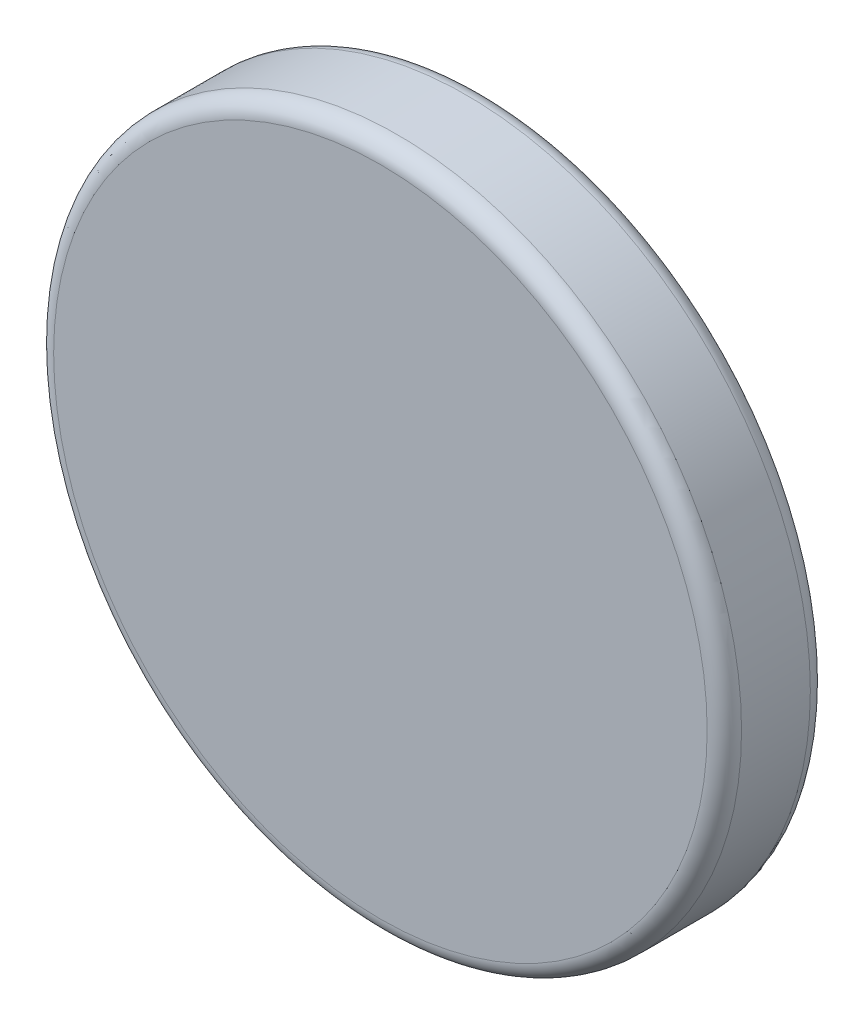
ISO-10303-21;
HEADER;
FILE_DESCRIPTION(('STEP AP214'),'2;1');
FILE_NAME('part.step','',(''),(''),'','','');
FILE_SCHEMA(('AUTOMOTIVE_DESIGN { 1 0 10303 214 1 1 1 1 }'));
ENDSEC;
DATA;
#1=APPLICATION_CONTEXT('core data for automotive mechanical design processes');
#2=APPLICATION_PROTOCOL_DEFINITION('international standard','automotive_design',2000,#1);
#3=PRODUCT_CONTEXT('',#1,'mechanical');
#4=PRODUCT('Part','Part','',(#3));
#5=PRODUCT_RELATED_PRODUCT_CATEGORY('part','',(#4));
#6=PRODUCT_DEFINITION_FORMATION('','',#4);
#7=PRODUCT_DEFINITION_CONTEXT('part definition',#1,'design');
#8=PRODUCT_DEFINITION('design','',#6,#7);
#9=PRODUCT_DEFINITION_SHAPE('','',#8);
#10=(LENGTH_UNIT() NAMED_UNIT(*) SI_UNIT(.MILLI.,.METRE.));
#11=(NAMED_UNIT(*) PLANE_ANGLE_UNIT() SI_UNIT($,.RADIAN.));
#12=(NAMED_UNIT(*) SI_UNIT($,.STERADIAN.) SOLID_ANGLE_UNIT());
#13=UNCERTAINTY_MEASURE_WITH_UNIT(LENGTH_MEASURE(1.E-05),#10,'distance_accuracy_value','');
#14=(GEOMETRIC_REPRESENTATION_CONTEXT(3) GLOBAL_UNCERTAINTY_ASSIGNED_CONTEXT((#13)) GLOBAL_UNIT_ASSIGNED_CONTEXT((#10,
#11,#12)) REPRESENTATION_CONTEXT('',''));
#15=CARTESIAN_POINT('',(0.,0.,0.));
#16=DIRECTION('',(0.,0.,1.));
#17=DIRECTION('',(1.,0.,0.));
#18=AXIS2_PLACEMENT_3D('',#15,#16,#17);
#19=CARTESIAN_POINT('',(-11.7,-6.2,-4.));
#20=DIRECTION('',(0.,0.,1.));
#21=DIRECTION('',(1.,0.,0.));
#22=AXIS2_PLACEMENT_3D('',#19,#20,#21);
#23=PLANE('',#22);
#24=CARTESIAN_POINT('',(-11.7,-6.2,-4.));
#25=DIRECTION('',(0.,0.,1.));
#26=DIRECTION('',(0.,-1.,0.));
#27=AXIS2_PLACEMENT_3D('',#24,#25,#26);
#28=CIRCLE('',#27,8.5);
#29=CARTESIAN_POINT('',(-11.7,-14.7,-4.));
#30=VERTEX_POINT('',#29);
#31=EDGE_CURVE('E106',#30,#30,#28,.T.);
#32=ORIENTED_EDGE('',*,*,#31,.F.);
#33=EDGE_LOOP('',(#32));
#34=FACE_BOUND('',#33,.T.);
#35=ADVANCED_FACE('F15',(#34),#23,.F.);
#36=CARTESIAN_POINT('',(-11.7,-6.2,-3.5));
#37=DIRECTION('',(0.,0.,1.));
#38=DIRECTION('',(1.,0.,0.));
#39=AXIS2_PLACEMENT_3D('',#36,#37,#38);
#40=TOROIDAL_SURFACE('',#39,8.5,0.5);
#41=ORIENTED_EDGE('',*,*,#31,.T.);
#42=EDGE_LOOP('',(#41));
#43=FACE_BOUND('',#42,.T.);
#44=CARTESIAN_POINT('',(-11.7,-6.2,-3.5));
#45=DIRECTION('',(0.,0.,1.));
#46=DIRECTION('',(1.,0.,0.));
#47=AXIS2_PLACEMENT_3D('',#44,#45,#46);
#48=CIRCLE('',#47,9.);
#49=CARTESIAN_POINT('',(-2.7,-6.2,-3.5));
#50=VERTEX_POINT('',#49);
#51=EDGE_CURVE('E19',#50,#50,#48,.F.);
#52=ORIENTED_EDGE('',*,*,#51,.T.);
#53=EDGE_LOOP('',(#52));
#54=FACE_BOUND('',#53,.T.);
#55=ADVANCED_FACE('F93',(#43,#54),#40,.T.);
#56=CARTESIAN_POINT('',(-11.7,-15.2,-3.5));
#57=DIRECTION('',(0.,0.,1.));
#58=DIRECTION('',(1.,0.,0.));
#59=AXIS2_PLACEMENT_3D('',#56,#57,#58);
#60=PLANE('',#59);
#61=ORIENTED_EDGE('',*,*,#51,.F.);
#62=EDGE_LOOP('',(#61));
#63=FACE_BOUND('',#62,.T.);
#64=CARTESIAN_POINT('',(-11.7,-6.2,-3.5));
#65=DIRECTION('',(0.,0.,1.));
#66=DIRECTION('',(0.,-1.,0.));
#67=AXIS2_PLACEMENT_3D('',#64,#65,#66);
#68=CIRCLE('',#67,9.5);
#69=CARTESIAN_POINT('',(-11.7,-15.7,-3.5));
#70=VERTEX_POINT('',#69);
#71=EDGE_CURVE('E33',#70,#70,#68,.T.);
#72=ORIENTED_EDGE('',*,*,#71,.F.);
#73=EDGE_LOOP('',(#72));
#74=FACE_BOUND('',#73,.T.);
#75=ADVANCED_FACE('F63',(#63,#74),#60,.F.);
#76=CARTESIAN_POINT('',(-11.7,-6.2,-3.));
#77=DIRECTION('',(0.,0.,1.));
#78=DIRECTION('',(1.,0.,0.));
#79=AXIS2_PLACEMENT_3D('',#76,#77,#78);
#80=TOROIDAL_SURFACE('',#79,9.5,0.5);
#81=ORIENTED_EDGE('',*,*,#71,.T.);
#82=EDGE_LOOP('',(#81));
#83=FACE_BOUND('',#82,.T.);
#84=CARTESIAN_POINT('',(-11.7,-6.2,-3.));
#85=DIRECTION('',(0.,0.,1.));
#86=DIRECTION('',(1.,0.,0.));
#87=AXIS2_PLACEMENT_3D('',#84,#85,#86);
#88=CIRCLE('',#87,10.);
#89=CARTESIAN_POINT('',(-1.7,-6.2,-3.));
#90=VERTEX_POINT('',#89);
#91=EDGE_CURVE('E28',#90,#90,#88,.T.);
#92=ORIENTED_EDGE('',*,*,#91,.F.);
#93=EDGE_LOOP('',(#92));
#94=FACE_BOUND('',#93,.T.);
#95=ADVANCED_FACE('F58',(#83,#94),#80,.T.);
#96=CARTESIAN_POINT('',(-11.7,-6.2,-0.5));
#97=DIRECTION('',(0.,0.,1.));
#98=DIRECTION('',(1.,0.,0.));
#99=AXIS2_PLACEMENT_3D('',#96,#97,#98);
#100=CYLINDRICAL_SURFACE('',#99,10.);
#101=CARTESIAN_POINT('',(-11.7,-6.2,-1.));
#102=DIRECTION('',(0.,0.,-1.));
#103=DIRECTION('',(-1.,0.,0.));
#104=AXIS2_PLACEMENT_3D('',#101,#102,#103);
#105=CIRCLE('',#104,10.);
#106=CARTESIAN_POINT('',(-21.7,-6.2,-1.));
#107=VERTEX_POINT('',#106);
#108=EDGE_CURVE('E23',#107,#107,#105,.F.);
#109=ORIENTED_EDGE('',*,*,#108,.F.);
#110=EDGE_LOOP('',(#109));
#111=FACE_BOUND('',#110,.T.);
#112=ORIENTED_EDGE('',*,*,#91,.T.);
#113=EDGE_LOOP('',(#112));
#114=FACE_BOUND('',#113,.T.);
#115=ADVANCED_FACE('F54',(#111,#114),#100,.T.);
#116=CARTESIAN_POINT('',(-11.7,-6.2,-1.));
#117=DIRECTION('',(0.,0.,-1.));
#118=DIRECTION('',(-1.,0.,0.));
#119=AXIS2_PLACEMENT_3D('',#116,#117,#118);
#120=TOROIDAL_SURFACE('',#119,9.5,0.5);
#121=ORIENTED_EDGE('',*,*,#108,.T.);
#122=EDGE_LOOP('',(#121));
#123=FACE_BOUND('',#122,.T.);
#124=CARTESIAN_POINT('',(-11.7,-6.2,-0.5));
#125=DIRECTION('',(0.,0.,-1.));
#126=DIRECTION('',(0.,-1.,0.));
#127=AXIS2_PLACEMENT_3D('',#124,#125,#126);
#128=CIRCLE('',#127,9.5);
#129=CARTESIAN_POINT('',(-11.7,-15.7,-0.5));
#130=VERTEX_POINT('',#129);
#131=EDGE_CURVE('E10',#130,#130,#128,.T.);
#132=ORIENTED_EDGE('',*,*,#131,.T.);
#133=EDGE_LOOP('',(#132));
#134=FACE_BOUND('',#133,.T.);
#135=ADVANCED_FACE('F43',(#123,#134),#120,.T.);
#136=CARTESIAN_POINT('',(-11.7,-16.2,-0.499999999999993));
#137=DIRECTION('',(0.,0.,-1.));
#138=DIRECTION('',(-1.,0.,0.));
#139=AXIS2_PLACEMENT_3D('',#136,#137,#138);
#140=PLANE('',#139);
#141=ORIENTED_EDGE('',*,*,#131,.F.);
#142=EDGE_LOOP('',(#141));
#143=FACE_BOUND('',#142,.T.);
#144=ADVANCED_FACE('F53',(#143),#140,.F.);
#145=CLOSED_SHELL('',(#35,#55,#75,#95,#115,#135,#144));
#146=MANIFOLD_SOLID_BREP('B1',#145);
#147=ADVANCED_BREP_SHAPE_REPRESENTATION('',(#18,#146),#14);
#148=SHAPE_DEFINITION_REPRESENTATION(#9,#147);
ENDSEC;
END-ISO-10303-21;
